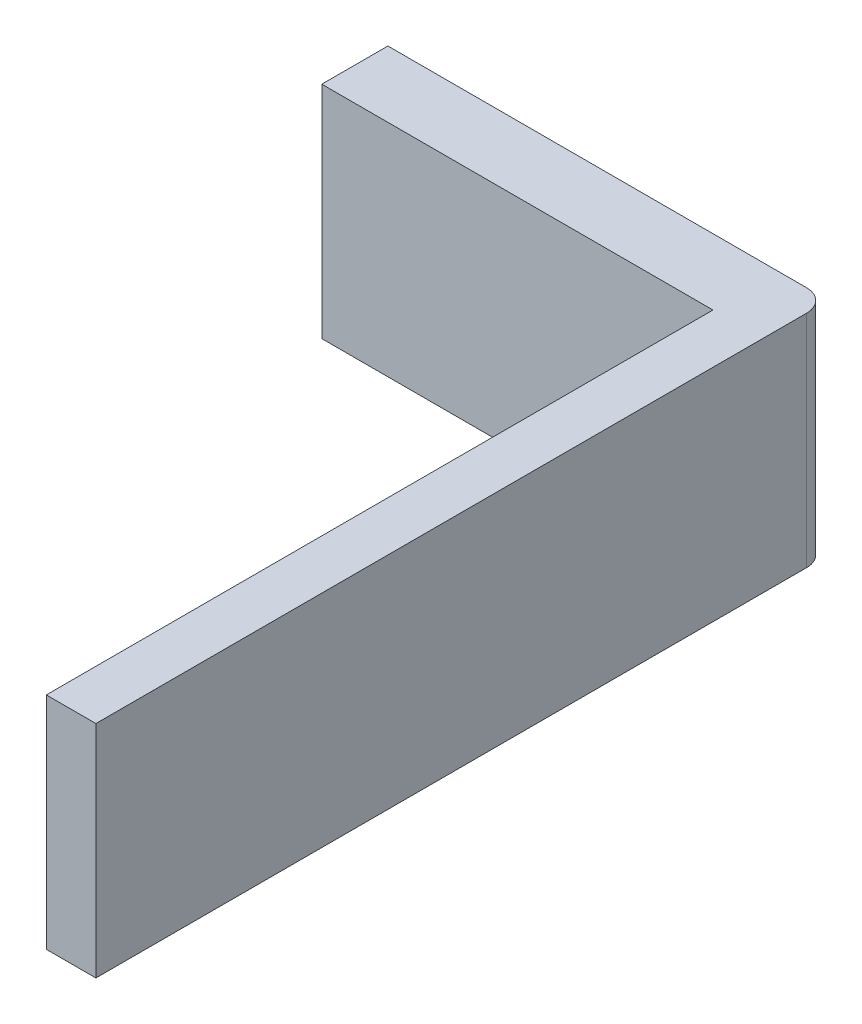
ISO-10303-21;
HEADER;
FILE_DESCRIPTION(('STEP AP214'),'2;1');
FILE_NAME('part.step','',(''),(''),'','','');
FILE_SCHEMA(('AUTOMOTIVE_DESIGN { 1 0 10303 214 1 1 1 1 }'));
ENDSEC;
DATA;
#1=APPLICATION_CONTEXT('core data for automotive mechanical design processes');
#2=APPLICATION_PROTOCOL_DEFINITION('international standard','automotive_design',2000,#1);
#3=PRODUCT_CONTEXT('',#1,'mechanical');
#4=PRODUCT('Part','Part','',(#3));
#5=PRODUCT_RELATED_PRODUCT_CATEGORY('part','',(#4));
#6=PRODUCT_DEFINITION_FORMATION('','',#4);
#7=PRODUCT_DEFINITION_CONTEXT('part definition',#1,'design');
#8=PRODUCT_DEFINITION('design','',#6,#7);
#9=PRODUCT_DEFINITION_SHAPE('','',#8);
#10=(LENGTH_UNIT() NAMED_UNIT(*) SI_UNIT(.MILLI.,.METRE.));
#11=(NAMED_UNIT(*) PLANE_ANGLE_UNIT() SI_UNIT($,.RADIAN.));
#12=(NAMED_UNIT(*) SI_UNIT($,.STERADIAN.) SOLID_ANGLE_UNIT());
#13=UNCERTAINTY_MEASURE_WITH_UNIT(LENGTH_MEASURE(1.E-05),#10,'distance_accuracy_value','');
#14=(GEOMETRIC_REPRESENTATION_CONTEXT(3) GLOBAL_UNCERTAINTY_ASSIGNED_CONTEXT((#13)) GLOBAL_UNIT_ASSIGNED_CONTEXT((#10,
#11,#12)) REPRESENTATION_CONTEXT('',''));
#15=CARTESIAN_POINT('',(0.,0.,0.));
#16=DIRECTION('',(0.,0.,1.));
#17=DIRECTION('',(1.,0.,0.));
#18=AXIS2_PLACEMENT_3D('',#15,#16,#17);
#19=CARTESIAN_POINT('',(-4.5,20.,0.));
#20=DIRECTION('',(1.,0.,0.));
#21=DIRECTION('',(0.,0.,-1.));
#22=AXIS2_PLACEMENT_3D('',#19,#20,#21);
#23=PLANE('',#22);
#24=DIRECTION('',(0.,0.,1.));
#25=VECTOR('',#24,1.);
#26=CARTESIAN_POINT('',(-4.5,0.,0.));
#27=LINE('',#26,#25);
#28=CARTESIAN_POINT('',(-4.5,0.,4.5));
#29=VERTEX_POINT('',#28);
#30=CARTESIAN_POINT('',(-4.49999999999999,0.,65.));
#31=VERTEX_POINT('',#30);
#32=EDGE_CURVE('E114',#29,#31,#27,.T.);
#33=ORIENTED_EDGE('',*,*,#32,.T.);
#34=DIRECTION('',(0.,-1.,0.));
#35=VECTOR('',#34,1.);
#36=CARTESIAN_POINT('',(-4.49999999999999,20.,65.));
#37=LINE('',#36,#35);
#38=CARTESIAN_POINT('',(-4.49999999999999,20.,65.));
#39=VERTEX_POINT('',#38);
#40=EDGE_CURVE('E142',#39,#31,#37,.T.);
#41=ORIENTED_EDGE('',*,*,#40,.F.);
#42=DIRECTION('',(0.,0.,1.));
#43=VECTOR('',#42,1.);
#44=CARTESIAN_POINT('',(-4.5,20.,0.));
#45=LINE('',#44,#43);
#46=CARTESIAN_POINT('',(-4.5,20.,4.5));
#47=VERTEX_POINT('',#46);
#48=EDGE_CURVE('E117',#47,#39,#45,.T.);
#49=ORIENTED_EDGE('',*,*,#48,.F.);
#50=DIRECTION('',(0.,-1.,0.));
#51=VECTOR('',#50,1.);
#52=CARTESIAN_POINT('',(-4.5,20.,4.5));
#53=LINE('',#52,#51);
#54=EDGE_CURVE('E127',#47,#29,#53,.T.);
#55=ORIENTED_EDGE('',*,*,#54,.T.);
#56=EDGE_LOOP('',(#33,#41,#49,#55));
#57=FACE_BOUND('',#56,.T.);
#58=ADVANCED_FACE('F33',(#57),#23,.F.);
#59=CARTESIAN_POINT('',(0.,20.,65.));
#60=DIRECTION('',(0.,0.,1.));
#61=DIRECTION('',(1.,0.,0.));
#62=AXIS2_PLACEMENT_3D('',#59,#60,#61);
#63=PLANE('',#62);
#64=DIRECTION('',(-1.,0.,0.));
#65=VECTOR('',#64,1.);
#66=CARTESIAN_POINT('',(0.,0.,65.));
#67=LINE('',#66,#65);
#68=CARTESIAN_POINT('',(0.,0.,65.));
#69=VERTEX_POINT('',#68);
#70=EDGE_CURVE('E130',#69,#31,#67,.T.);
#71=ORIENTED_EDGE('',*,*,#70,.F.);
#72=DIRECTION('',(0.,-1.,0.));
#73=VECTOR('',#72,1.);
#74=CARTESIAN_POINT('',(0.,20.,65.));
#75=LINE('',#74,#73);
#76=CARTESIAN_POINT('',(0.,20.,65.));
#77=VERTEX_POINT('',#76);
#78=EDGE_CURVE('E139',#77,#69,#75,.T.);
#79=ORIENTED_EDGE('',*,*,#78,.F.);
#80=DIRECTION('',(-1.,0.,0.));
#81=VECTOR('',#80,1.);
#82=CARTESIAN_POINT('',(0.,20.,65.));
#83=LINE('',#82,#81);
#84=EDGE_CURVE('E119',#77,#39,#83,.T.);
#85=ORIENTED_EDGE('',*,*,#84,.T.);
#86=ORIENTED_EDGE('',*,*,#40,.T.);
#87=EDGE_LOOP('',(#71,#79,#85,#86));
#88=FACE_BOUND('',#87,.T.);
#89=ADVANCED_FACE('F148',(#88),#63,.T.);
#90=CARTESIAN_POINT('',(0.,20.,0.));
#91=DIRECTION('',(1.,0.,0.));
#92=DIRECTION('',(0.,0.,-1.));
#93=AXIS2_PLACEMENT_3D('',#90,#91,#92);
#94=PLANE('',#93);
#95=DIRECTION('',(0.,0.,1.));
#96=VECTOR('',#95,1.);
#97=CARTESIAN_POINT('',(0.,0.,0.));
#98=LINE('',#97,#96);
#99=CARTESIAN_POINT('',(0.,0.,0.5));
#100=VERTEX_POINT('',#99);
#101=EDGE_CURVE('E107',#100,#69,#98,.T.);
#102=ORIENTED_EDGE('',*,*,#101,.F.);
#103=DIRECTION('',(0.,-1.,0.));
#104=VECTOR('',#103,1.);
#105=CARTESIAN_POINT('',(0.,20.,0.5));
#106=LINE('',#105,#104);
#107=CARTESIAN_POINT('',(0.,20.,0.5));
#108=VERTEX_POINT('',#107);
#109=EDGE_CURVE('E41',#100,#108,#106,.F.);
#110=ORIENTED_EDGE('',*,*,#109,.T.);
#111=DIRECTION('',(0.,0.,1.));
#112=VECTOR('',#111,1.);
#113=CARTESIAN_POINT('',(0.,20.,0.));
#114=LINE('',#113,#112);
#115=EDGE_CURVE('E122',#108,#77,#114,.T.);
#116=ORIENTED_EDGE('',*,*,#115,.T.);
#117=ORIENTED_EDGE('',*,*,#78,.T.);
#118=EDGE_LOOP('',(#102,#110,#116,#117));
#119=FACE_BOUND('',#118,.T.);
#120=ADVANCED_FACE('F154',(#119),#94,.T.);
#121=CARTESIAN_POINT('',(-40.,20.,4.5));
#122=DIRECTION('',(-1.,0.,0.));
#123=DIRECTION('',(0.,0.,1.));
#124=AXIS2_PLACEMENT_3D('',#121,#122,#123);
#125=PLANE('',#124);
#126=DIRECTION('',(0.,0.,-1.));
#127=VECTOR('',#126,1.);
#128=CARTESIAN_POINT('',(-40.,0.,4.5));
#129=LINE('',#128,#127);
#130=CARTESIAN_POINT('',(-40.,0.,4.5));
#131=VERTEX_POINT('',#130);
#132=CARTESIAN_POINT('',(-40.,0.,-1.5));
#133=VERTEX_POINT('',#132);
#134=EDGE_CURVE('E102',#131,#133,#129,.T.);
#135=ORIENTED_EDGE('',*,*,#134,.F.);
#136=DIRECTION('',(0.,-1.,0.));
#137=VECTOR('',#136,1.);
#138=CARTESIAN_POINT('',(-40.,20.,4.5));
#139=LINE('',#138,#137);
#140=CARTESIAN_POINT('',(-40.,20.,4.5));
#141=VERTEX_POINT('',#140);
#142=EDGE_CURVE('E137',#141,#131,#139,.T.);
#143=ORIENTED_EDGE('',*,*,#142,.F.);
#144=DIRECTION('',(0.,0.,-1.));
#145=VECTOR('',#144,1.);
#146=CARTESIAN_POINT('',(-40.,20.,4.5));
#147=LINE('',#146,#145);
#148=CARTESIAN_POINT('',(-40.,20.,-1.5));
#149=VERTEX_POINT('',#148);
#150=EDGE_CURVE('E111',#141,#149,#147,.T.);
#151=ORIENTED_EDGE('',*,*,#150,.T.);
#152=DIRECTION('',(0.,1.,0.));
#153=VECTOR('',#152,1.);
#154=CARTESIAN_POINT('',(-40.,20.,-1.5));
#155=LINE('',#154,#153);
#156=EDGE_CURVE('E95',#133,#149,#155,.T.);
#157=ORIENTED_EDGE('',*,*,#156,.F.);
#158=EDGE_LOOP('',(#135,#143,#151,#157));
#159=FACE_BOUND('',#158,.T.);
#160=ADVANCED_FACE('F109',(#159),#125,.T.);
#161=CARTESIAN_POINT('',(0.,20.,4.5));
#162=DIRECTION('',(0.,0.,-1.));
#163=DIRECTION('',(-1.,0.,0.));
#164=AXIS2_PLACEMENT_3D('',#161,#162,#163);
#165=PLANE('',#164);
#166=DIRECTION('',(1.,0.,0.));
#167=VECTOR('',#166,1.);
#168=CARTESIAN_POINT('',(0.,0.,4.5));
#169=LINE('',#168,#167);
#170=EDGE_CURVE('E105',#131,#29,#169,.T.);
#171=ORIENTED_EDGE('',*,*,#170,.T.);
#172=ORIENTED_EDGE('',*,*,#54,.F.);
#173=DIRECTION('',(1.,0.,0.));
#174=VECTOR('',#173,1.);
#175=CARTESIAN_POINT('',(0.,20.,4.5));
#176=LINE('',#175,#174);
#177=EDGE_CURVE('E125',#141,#47,#176,.T.);
#178=ORIENTED_EDGE('',*,*,#177,.F.);
#179=ORIENTED_EDGE('',*,*,#142,.T.);
#180=EDGE_LOOP('',(#171,#172,#178,#179));
#181=FACE_BOUND('',#180,.T.);
#182=ADVANCED_FACE('F160',(#181),#165,.F.);
#183=CARTESIAN_POINT('',(0.,20.,0.));
#184=DIRECTION('',(0.,-1.,0.));
#185=DIRECTION('',(-1.,0.,0.));
#186=AXIS2_PLACEMENT_3D('',#183,#184,#185);
#187=PLANE('',#186);
#188=ORIENTED_EDGE('',*,*,#115,.F.);
#189=CARTESIAN_POINT('',(-2.,20.,0.5));
#190=DIRECTION('',(0.,-1.,0.));
#191=DIRECTION('',(0.,0.,-1.));
#192=AXIS2_PLACEMENT_3D('',#189,#190,#191);
#193=CIRCLE('',#192,2.);
#194=CARTESIAN_POINT('',(-2.,20.,-1.5));
#195=VERTEX_POINT('',#194);
#196=EDGE_CURVE('E11',#108,#195,#193,.F.);
#197=ORIENTED_EDGE('',*,*,#196,.T.);
#198=DIRECTION('',(1.,0.,0.));
#199=VECTOR('',#198,1.);
#200=CARTESIAN_POINT('',(0.,20.,-1.5));
#201=LINE('',#200,#199);
#202=EDGE_CURVE('E112',#149,#195,#201,.T.);
#203=ORIENTED_EDGE('',*,*,#202,.F.);
#204=ORIENTED_EDGE('',*,*,#150,.F.);
#205=ORIENTED_EDGE('',*,*,#177,.T.);
#206=ORIENTED_EDGE('',*,*,#48,.T.);
#207=ORIENTED_EDGE('',*,*,#84,.F.);
#208=EDGE_LOOP('',(#188,#197,#203,#204,#205,#206,#207));
#209=FACE_BOUND('',#208,.T.);
#210=ADVANCED_FACE('F156',(#209),#187,.F.);
#211=CARTESIAN_POINT('',(0.,0.,0.));
#212=DIRECTION('',(0.,-1.,0.));
#213=DIRECTION('',(-1.,0.,0.));
#214=AXIS2_PLACEMENT_3D('',#211,#212,#213);
#215=PLANE('',#214);
#216=DIRECTION('',(-1.,0.,0.));
#217=VECTOR('',#216,1.);
#218=CARTESIAN_POINT('',(0.,0.,-1.5));
#219=LINE('',#218,#217);
#220=CARTESIAN_POINT('',(-2.,0.,-1.5));
#221=VERTEX_POINT('',#220);
#222=EDGE_CURVE('E90',#221,#133,#219,.T.);
#223=ORIENTED_EDGE('',*,*,#222,.F.);
#224=CARTESIAN_POINT('',(-2.,0.,0.5));
#225=DIRECTION('',(0.,-1.,0.));
#226=DIRECTION('',(0.,0.,-1.));
#227=AXIS2_PLACEMENT_3D('',#224,#225,#226);
#228=CIRCLE('',#227,2.);
#229=EDGE_CURVE('E55',#221,#100,#228,.T.);
#230=ORIENTED_EDGE('',*,*,#229,.T.);
#231=ORIENTED_EDGE('',*,*,#101,.T.);
#232=ORIENTED_EDGE('',*,*,#70,.T.);
#233=ORIENTED_EDGE('',*,*,#32,.F.);
#234=ORIENTED_EDGE('',*,*,#170,.F.);
#235=ORIENTED_EDGE('',*,*,#134,.T.);
#236=EDGE_LOOP('',(#223,#230,#231,#232,#233,#234,#235));
#237=FACE_BOUND('',#236,.T.);
#238=ADVANCED_FACE('F103',(#237),#215,.T.);
#239=CARTESIAN_POINT('',(0.,0.,-1.5));
#240=DIRECTION('',(0.,0.,-1.));
#241=DIRECTION('',(-1.,0.,0.));
#242=AXIS2_PLACEMENT_3D('',#239,#240,#241);
#243=PLANE('',#242);
#244=ORIENTED_EDGE('',*,*,#202,.T.);
#245=DIRECTION('',(0.,-1.,0.));
#246=VECTOR('',#245,1.);
#247=CARTESIAN_POINT('',(-2.,0.,-1.5));
#248=LINE('',#247,#246);
#249=EDGE_CURVE('E98',#195,#221,#248,.T.);
#250=ORIENTED_EDGE('',*,*,#249,.T.);
#251=ORIENTED_EDGE('',*,*,#222,.T.);
#252=ORIENTED_EDGE('',*,*,#156,.T.);
#253=EDGE_LOOP('',(#244,#250,#251,#252));
#254=FACE_BOUND('',#253,.T.);
#255=ADVANCED_FACE('F93',(#254),#243,.T.);
#256=CARTESIAN_POINT('',(-2.,0.,0.5));
#257=DIRECTION('',(0.,-1.,0.));
#258=DIRECTION('',(0.,0.,-1.));
#259=AXIS2_PLACEMENT_3D('',#256,#257,#258);
#260=CYLINDRICAL_SURFACE('',#259,2.);
#261=ORIENTED_EDGE('',*,*,#196,.F.);
#262=ORIENTED_EDGE('',*,*,#109,.F.);
#263=ORIENTED_EDGE('',*,*,#229,.F.);
#264=ORIENTED_EDGE('',*,*,#249,.F.);
#265=EDGE_LOOP('',(#261,#262,#263,#264));
#266=FACE_BOUND('',#265,.T.);
#267=ADVANCED_FACE('F35',(#266),#260,.T.);
#268=CLOSED_SHELL('',(#58,#89,#120,#160,#182,#210,#238,#255,#267));
#269=MANIFOLD_SOLID_BREP('B2',#268);
#270=ADVANCED_BREP_SHAPE_REPRESENTATION('',(#18,#269),#14);
#271=SHAPE_DEFINITION_REPRESENTATION(#9,#270);
ENDSEC;
END-ISO-10303-21;
